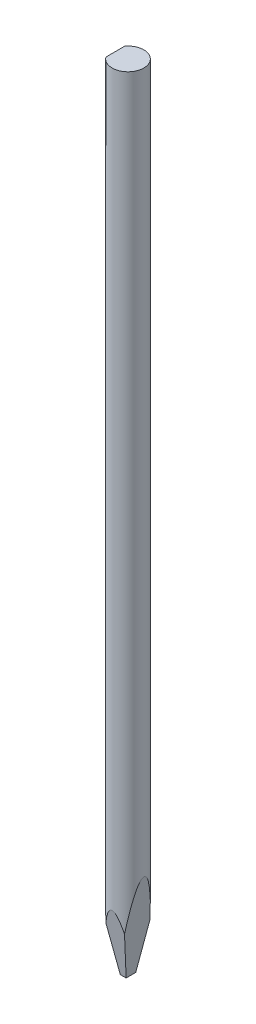
ISO-10303-21;
HEADER;
FILE_DESCRIPTION(('STEP AP214'),'2;1');
FILE_NAME('part.step','',(''),(''),'','','');
FILE_SCHEMA(('AUTOMOTIVE_DESIGN { 1 0 10303 214 1 1 1 1 }'));
ENDSEC;
DATA;
#1=APPLICATION_CONTEXT('core data for automotive mechanical design processes');
#2=APPLICATION_PROTOCOL_DEFINITION('international standard','automotive_design',2000,#1);
#3=PRODUCT_CONTEXT('',#1,'mechanical');
#4=PRODUCT('Part','Part','',(#3));
#5=PRODUCT_RELATED_PRODUCT_CATEGORY('part','',(#4));
#6=PRODUCT_DEFINITION_FORMATION('','',#4);
#7=PRODUCT_DEFINITION_CONTEXT('part definition',#1,'design');
#8=PRODUCT_DEFINITION('design','',#6,#7);
#9=PRODUCT_DEFINITION_SHAPE('','',#8);
#10=(LENGTH_UNIT() NAMED_UNIT(*) SI_UNIT(.MILLI.,.METRE.));
#11=(NAMED_UNIT(*) PLANE_ANGLE_UNIT() SI_UNIT($,.RADIAN.));
#12=(NAMED_UNIT(*) SI_UNIT($,.STERADIAN.) SOLID_ANGLE_UNIT());
#13=UNCERTAINTY_MEASURE_WITH_UNIT(LENGTH_MEASURE(1.E-05),#10,'distance_accuracy_value','');
#14=(GEOMETRIC_REPRESENTATION_CONTEXT(3) GLOBAL_UNCERTAINTY_ASSIGNED_CONTEXT((#13)) GLOBAL_UNIT_ASSIGNED_CONTEXT((#10,
#11,#12)) REPRESENTATION_CONTEXT('',''));
#15=CARTESIAN_POINT('',(0.,0.,0.));
#16=DIRECTION('',(0.,0.,1.));
#17=DIRECTION('',(1.,0.,0.));
#18=AXIS2_PLACEMENT_3D('',#15,#16,#17);
#19=CARTESIAN_POINT('',(0.,75.9968,0.));
#20=DIRECTION('',(0.,-1.,0.));
#21=DIRECTION('',(0.,0.,-1.));
#22=AXIS2_PLACEMENT_3D('',#19,#20,#21);
#23=CYLINDRICAL_SURFACE('',#22,1.4986);
#24=CARTESIAN_POINT('',(0.,-1.0826221440547,0.));
#25=DIRECTION('',(-0.99026806874157,-0.139173100960066,0.));
#26=DIRECTION('',(0.139173100960066,-0.99026806874157,0.));
#27=AXIS2_PLACEMENT_3D('',#24,#25,#26);
#28=ELLIPSE('',#27,10.7678853863435,1.4986);
#29=CARTESIAN_POINT('',(-0.880057177650525,5.17931005176671,1.21297210358103));
#30=VERTEX_POINT('',#29);
#31=CARTESIAN_POINT('',(-1.20142,7.46592534781211,0.89576333012688));
#32=VERTEX_POINT('',#31);
#33=EDGE_CURVE('E55',#30,#32,#28,.T.);
#34=ORIENTED_EDGE('',*,*,#33,.F.);
#35=CARTESIAN_POINT('',(0.,-1.69979658697582,0.));
#36=DIRECTION('',(0.,-0.173648177666931,0.984807753012208));
#37=DIRECTION('',(0.,-0.984807753012208,-0.173648177666931));
#38=AXIS2_PLACEMENT_3D('',#35,#36,#37);
#39=ELLIPSE('',#38,8.630093446039,1.4986);
#40=CARTESIAN_POINT('',(0.881665693930592,5.17268220070924,1.21180343461548));
#41=VERTEX_POINT('',#40);
#42=EDGE_CURVE('E48',#41,#30,#39,.T.);
#43=ORIENTED_EDGE('',*,*,#42,.F.);
#44=CARTESIAN_POINT('',(0.,-1.10069518314969,0.));
#45=DIRECTION('',(0.990268068741571,-0.139173100960058,0.));
#46=DIRECTION('',(-0.139173100960058,-0.990268068741571,0.));
#47=AXIS2_PLACEMENT_3D('',#44,#45,#46);
#48=ELLIPSE('',#47,10.7678853863441,1.4986);
#49=CARTESIAN_POINT('',(0.881665693930592,5.17268220070924,-1.21180343461548));
#50=VERTEX_POINT('',#49);
#51=EDGE_CURVE('E132',#50,#41,#48,.T.);
#52=ORIENTED_EDGE('',*,*,#51,.F.);
#53=CARTESIAN_POINT('',(0.,-1.69979658697582,0.));
#54=DIRECTION('',(0.,-0.173648177666931,-0.984807753012208));
#55=DIRECTION('',(0.,-0.984807753012208,0.173648177666931));
#56=AXIS2_PLACEMENT_3D('',#53,#54,#55);
#57=ELLIPSE('',#56,8.630093446039,1.4986);
#58=CARTESIAN_POINT('',(-0.880057177650525,5.17931005176671,-1.21297210358103));
#59=VERTEX_POINT('',#58);
#60=EDGE_CURVE('E11',#59,#50,#57,.T.);
#61=ORIENTED_EDGE('',*,*,#60,.F.);
#62=CARTESIAN_POINT('',(-1.20142,7.46592534781211,-0.89576333012688));
#63=VERTEX_POINT('',#62);
#64=EDGE_CURVE('E111',#63,#59,#28,.T.);
#65=ORIENTED_EDGE('',*,*,#64,.F.);
#66=DIRECTION('',(0.,-1.,0.));
#67=VECTOR('',#66,1.);
#68=CARTESIAN_POINT('',(-1.20142,75.9968,-0.89576333012688));
#69=LINE('',#68,#67);
#70=CARTESIAN_POINT('',(-1.20142,75.9968,-0.89576333012688));
#71=VERTEX_POINT('',#70);
#72=EDGE_CURVE('E125',#71,#63,#69,.T.);
#73=ORIENTED_EDGE('',*,*,#72,.F.);
#74=CARTESIAN_POINT('',(0.,75.9968,0.));
#75=DIRECTION('',(0.,1.,0.));
#76=DIRECTION('',(0.,0.,1.));
#77=AXIS2_PLACEMENT_3D('',#74,#75,#76);
#78=CIRCLE('',#77,1.4986);
#79=CARTESIAN_POINT('',(-1.20142,75.9968,0.89576333012688));
#80=VERTEX_POINT('',#79);
#81=EDGE_CURVE('E127',#80,#71,#78,.T.);
#82=ORIENTED_EDGE('',*,*,#81,.F.);
#83=DIRECTION('',(0.,-1.,0.));
#84=VECTOR('',#83,1.);
#85=CARTESIAN_POINT('',(-1.20142,75.9968,0.89576333012688));
#86=LINE('',#85,#84);
#87=EDGE_CURVE('E123',#32,#80,#86,.F.);
#88=ORIENTED_EDGE('',*,*,#87,.F.);
#89=EDGE_LOOP('',(#34,#43,#52,#61,#65,#73,#82,#88));
#90=FACE_BOUND('',#89,.T.);
#91=ADVANCED_FACE('F41',(#90),#23,.T.);
#92=CARTESIAN_POINT('',(-1.20142,75.9968,1.50859998));
#93=DIRECTION('',(-1.,0.,0.));
#94=DIRECTION('',(0.,0.,1.));
#95=AXIS2_PLACEMENT_3D('',#92,#93,#94);
#96=PLANE('',#95);
#97=ORIENTED_EDGE('',*,*,#72,.T.);
#98=DIRECTION('',(0.,0.,1.));
#99=VECTOR('',#98,1.);
#100=CARTESIAN_POINT('',(-1.20142,7.46592534781211,1.50859998));
#101=LINE('',#100,#99);
#102=EDGE_CURVE('E130',#63,#32,#101,.T.);
#103=ORIENTED_EDGE('',*,*,#102,.T.);
#104=ORIENTED_EDGE('',*,*,#87,.T.);
#105=DIRECTION('',(0.,0.,-1.));
#106=VECTOR('',#105,1.);
#107=CARTESIAN_POINT('',(-1.20142,75.9968,1.50859998));
#108=LINE('',#107,#106);
#109=EDGE_CURVE('E63',#80,#71,#108,.T.);
#110=ORIENTED_EDGE('',*,*,#109,.T.);
#111=EDGE_LOOP('',(#97,#103,#104,#110));
#112=FACE_BOUND('',#111,.T.);
#113=ADVANCED_FACE('F143',(#112),#96,.T.);
#114=CARTESIAN_POINT('',(0.,75.9968,0.));
#115=DIRECTION('',(0.,1.,0.));
#116=DIRECTION('',(0.,0.,1.));
#117=AXIS2_PLACEMENT_3D('',#114,#115,#116);
#118=PLANE('',#117);
#119=ORIENTED_EDGE('',*,*,#81,.T.);
#120=ORIENTED_EDGE('',*,*,#109,.F.);
#121=EDGE_LOOP('',(#119,#120));
#122=FACE_BOUND('',#121,.T.);
#123=ADVANCED_FACE('F145',(#122),#118,.T.);
#124=CARTESIAN_POINT('',(1.50859998,0.,-0.29972));
#125=DIRECTION('',(0.,-0.173648177666931,-0.984807753012208));
#126=DIRECTION('',(0.,0.984807753012208,-0.173648177666931));
#127=AXIS2_PLACEMENT_3D('',#124,#125,#126);
#128=PLANE('',#127);
#129=ORIENTED_EDGE('',*,*,#60,.T.);
#130=DIRECTION('',(-0.137098791054058,-0.975508586841574,0.172008483772957));
#131=VECTOR('',#130,1.);
#132=CARTESIAN_POINT('',(0.18014076882842,0.181072989139138,-0.331648053462761));
#133=LINE('',#132,#131);
#134=CARTESIAN_POINT('',(0.278228016306962,0.87900002,-0.454711419569281));
#135=VERTEX_POINT('',#134);
#136=EDGE_CURVE('E102',#50,#135,#133,.T.);
#137=ORIENTED_EDGE('',*,*,#136,.T.);
#138=DIRECTION('',(-1.,0.,0.));
#139=VECTOR('',#138,1.);
#140=CARTESIAN_POINT('',(1.50859998,0.87900002,-0.454711419569281));
#141=LINE('',#140,#139);
#142=CARTESIAN_POINT('',(-0.275688016306962,0.87900002,-0.454711419569281));
#143=VERTEX_POINT('',#142);
#144=EDGE_CURVE('E116',#135,#143,#141,.T.);
#145=ORIENTED_EDGE('',*,*,#144,.T.);
#146=DIRECTION('',(-0.137098791054065,0.975508586841573,-0.172008483772957));
#147=VECTOR('',#146,1.);
#148=CARTESIAN_POINT('',(-0.120936983543866,-0.222110793030218,-0.260555874482219));
#149=LINE('',#148,#147);
#150=EDGE_CURVE('E101',#143,#59,#149,.T.);
#151=ORIENTED_EDGE('',*,*,#150,.T.);
#152=EDGE_LOOP('',(#129,#137,#145,#151));
#153=FACE_BOUND('',#152,.T.);
#154=ADVANCED_FACE('F147',(#153),#128,.T.);
#155=CARTESIAN_POINT('',(1.50859998,0.,0.29972));
#156=DIRECTION('',(0.,-0.173648177666931,0.984807753012208));
#157=DIRECTION('',(0.,-0.984807753012208,-0.173648177666931));
#158=AXIS2_PLACEMENT_3D('',#155,#156,#157);
#159=PLANE('',#158);
#160=ORIENTED_EDGE('',*,*,#42,.T.);
#161=DIRECTION('',(0.137098791054065,-0.975508586841573,-0.172008483772957));
#162=VECTOR('',#161,1.);
#163=CARTESIAN_POINT('',(-0.120936983543866,-0.222110793030218,0.260555874482219));
#164=LINE('',#163,#162);
#165=CARTESIAN_POINT('',(-0.275688016306962,0.87900002,0.454711419569281));
#166=VERTEX_POINT('',#165);
#167=EDGE_CURVE('E93',#30,#166,#164,.T.);
#168=ORIENTED_EDGE('',*,*,#167,.T.);
#169=DIRECTION('',(1.,0.,0.));
#170=VECTOR('',#169,1.);
#171=CARTESIAN_POINT('',(1.50859998,0.87900002,0.454711419569281));
#172=LINE('',#171,#170);
#173=CARTESIAN_POINT('',(0.278228016306962,0.87900002,0.454711419569281));
#174=VERTEX_POINT('',#173);
#175=EDGE_CURVE('E98',#166,#174,#172,.T.);
#176=ORIENTED_EDGE('',*,*,#175,.T.);
#177=DIRECTION('',(0.137098791054058,0.975508586841574,0.172008483772957));
#178=VECTOR('',#177,1.);
#179=CARTESIAN_POINT('',(0.18014076882842,0.181072989139138,0.331648053462761));
#180=LINE('',#179,#178);
#181=EDGE_CURVE('E137',#174,#41,#180,.T.);
#182=ORIENTED_EDGE('',*,*,#181,.T.);
#183=EDGE_LOOP('',(#160,#168,#176,#182));
#184=FACE_BOUND('',#183,.T.);
#185=ADVANCED_FACE('F95',(#184),#159,.T.);
#186=CARTESIAN_POINT('',(0.27178,0.83312,1.50859998));
#187=DIRECTION('',(0.990268068741571,-0.139173100960058,0.));
#188=DIRECTION('',(0.139173100960058,0.990268068741571,0.));
#189=AXIS2_PLACEMENT_3D('',#186,#187,#188);
#190=PLANE('',#189);
#191=ORIENTED_EDGE('',*,*,#51,.T.);
#192=ORIENTED_EDGE('',*,*,#181,.F.);
#193=DIRECTION('',(0.,0.,1.));
#194=VECTOR('',#193,1.);
#195=CARTESIAN_POINT('',(0.278228016306962,0.87900002,1.50859998));
#196=LINE('',#195,#194);
#197=EDGE_CURVE('E115',#135,#174,#196,.T.);
#198=ORIENTED_EDGE('',*,*,#197,.F.);
#199=ORIENTED_EDGE('',*,*,#136,.F.);
#200=EDGE_LOOP('',(#191,#192,#198,#199));
#201=FACE_BOUND('',#200,.T.);
#202=ADVANCED_FACE('F136',(#201),#190,.T.);
#203=CARTESIAN_POINT('',(-0.26924,0.83312,1.50859998));
#204=DIRECTION('',(-0.99026806874157,-0.139173100960066,0.));
#205=DIRECTION('',(0.139173100960066,-0.99026806874157,0.));
#206=AXIS2_PLACEMENT_3D('',#203,#204,#205);
#207=PLANE('',#206);
#208=ORIENTED_EDGE('',*,*,#33,.T.);
#209=ORIENTED_EDGE('',*,*,#102,.F.);
#210=ORIENTED_EDGE('',*,*,#64,.T.);
#211=ORIENTED_EDGE('',*,*,#150,.F.);
#212=DIRECTION('',(0.,0.,-1.));
#213=VECTOR('',#212,1.);
#214=CARTESIAN_POINT('',(-0.275688016306962,0.87900002,1.50859998));
#215=LINE('',#214,#213);
#216=EDGE_CURVE('E106',#166,#143,#215,.T.);
#217=ORIENTED_EDGE('',*,*,#216,.F.);
#218=ORIENTED_EDGE('',*,*,#167,.F.);
#219=EDGE_LOOP('',(#208,#209,#210,#211,#217,#218));
#220=FACE_BOUND('',#219,.T.);
#221=ADVANCED_FACE('F107',(#220),#207,.T.);
#222=CARTESIAN_POINT('',(0.848359999999999,0.87900002,1.50859998));
#223=DIRECTION('',(0.,-1.,0.));
#224=DIRECTION('',(1.,0.,0.));
#225=AXIS2_PLACEMENT_3D('',#222,#223,#224);
#226=PLANE('',#225);
#227=ORIENTED_EDGE('',*,*,#197,.T.);
#228=ORIENTED_EDGE('',*,*,#175,.F.);
#229=ORIENTED_EDGE('',*,*,#216,.T.);
#230=ORIENTED_EDGE('',*,*,#144,.F.);
#231=EDGE_LOOP('',(#227,#228,#229,#230));
#232=FACE_BOUND('',#231,.T.);
#233=ADVANCED_FACE('F113',(#232),#226,.T.);
#234=CLOSED_SHELL('',(#91,#113,#123,#154,#185,#202,#221,#233));
#235=MANIFOLD_SOLID_BREP('B2',#234);
#236=ADVANCED_BREP_SHAPE_REPRESENTATION('',(#18,#235),#14);
#237=SHAPE_DEFINITION_REPRESENTATION(#9,#236);
ENDSEC;
END-ISO-10303-21;
